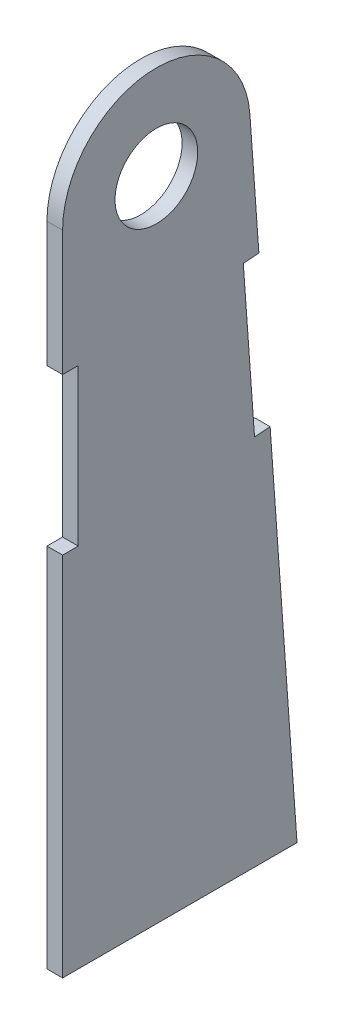
ISO-10303-21;
HEADER;
FILE_DESCRIPTION(('STEP AP214'),'2;1');
FILE_NAME('part.step','',(''),(''),'','','');
FILE_SCHEMA(('AUTOMOTIVE_DESIGN { 1 0 10303 214 1 1 1 1 }'));
ENDSEC;
DATA;
#1=APPLICATION_CONTEXT('core data for automotive mechanical design processes');
#2=APPLICATION_PROTOCOL_DEFINITION('international standard','automotive_design',2000,#1);
#3=PRODUCT_CONTEXT('',#1,'mechanical');
#4=PRODUCT('Part','Part','',(#3));
#5=PRODUCT_RELATED_PRODUCT_CATEGORY('part','',(#4));
#6=PRODUCT_DEFINITION_FORMATION('','',#4);
#7=PRODUCT_DEFINITION_CONTEXT('part definition',#1,'design');
#8=PRODUCT_DEFINITION('design','',#6,#7);
#9=PRODUCT_DEFINITION_SHAPE('','',#8);
#10=(LENGTH_UNIT() NAMED_UNIT(*) SI_UNIT(.MILLI.,.METRE.));
#11=(NAMED_UNIT(*) PLANE_ANGLE_UNIT() SI_UNIT($,.RADIAN.));
#12=(NAMED_UNIT(*) SI_UNIT($,.STERADIAN.) SOLID_ANGLE_UNIT());
#13=UNCERTAINTY_MEASURE_WITH_UNIT(LENGTH_MEASURE(1.E-05),#10,'distance_accuracy_value','');
#14=(GEOMETRIC_REPRESENTATION_CONTEXT(3) GLOBAL_UNCERTAINTY_ASSIGNED_CONTEXT((#13)) GLOBAL_UNIT_ASSIGNED_CONTEXT((#10,
#11,#12)) REPRESENTATION_CONTEXT('',''));
#15=CARTESIAN_POINT('',(0.,0.,0.));
#16=DIRECTION('',(0.,0.,1.));
#17=DIRECTION('',(1.,0.,0.));
#18=AXIS2_PLACEMENT_3D('',#15,#16,#17);
#19=CARTESIAN_POINT('',(1.5875,0.684323550732295,-9.50038558574931));
#20=DIRECTION('',(0.,-0.0718449922028656,0.997415809527486));
#21=DIRECTION('',(0.,-0.997415809527486,-0.0718449922028656));
#22=AXIS2_PLACEMENT_3D('',#19,#20,#21);
#23=PLANE('',#22);
#24=DIRECTION('',(0.,0.997415809527486,0.0718449922028656));
#25=VECTOR('',#24,1.);
#26=CARTESIAN_POINT('',(0.,0.684323550732295,-9.50038558574931));
#27=LINE('',#26,#25);
#28=CARTESIAN_POINT('',(0.,-11.9828572302668,-10.4128169867257));
#29=VERTEX_POINT('',#28);
#30=CARTESIAN_POINT('',(0.,0.684323550732295,-9.50038558574931));
#31=VERTEX_POINT('',#30);
#32=EDGE_CURVE('E177',#29,#31,#27,.T.);
#33=ORIENTED_EDGE('',*,*,#32,.T.);
#34=DIRECTION('',(-1.,0.,0.));
#35=VECTOR('',#34,1.);
#36=CARTESIAN_POINT('',(1.5875,0.684323550732295,-9.50038558574931));
#37=LINE('',#36,#35);
#38=CARTESIAN_POINT('',(1.5875,0.684323550732295,-9.50038558574931));
#39=VERTEX_POINT('',#38);
#40=EDGE_CURVE('E11',#39,#31,#37,.T.);
#41=ORIENTED_EDGE('',*,*,#40,.F.);
#42=DIRECTION('',(0.,0.997415809527486,0.0718449922028656));
#43=VECTOR('',#42,1.);
#44=CARTESIAN_POINT('',(1.5875,0.684323550732295,-9.50038558574931));
#45=LINE('',#44,#43);
#46=CARTESIAN_POINT('',(1.5875,-11.9828572302668,-10.4128169867257));
#47=VERTEX_POINT('',#46);
#48=EDGE_CURVE('E216',#47,#39,#45,.T.);
#49=ORIENTED_EDGE('',*,*,#48,.F.);
#50=DIRECTION('',(-1.,0.,0.));
#51=VECTOR('',#50,1.);
#52=CARTESIAN_POINT('',(1.5875,-11.9828572302668,-10.4128169867257));
#53=LINE('',#52,#51);
#54=EDGE_CURVE('E65',#47,#29,#53,.T.);
#55=ORIENTED_EDGE('',*,*,#54,.T.);
#56=EDGE_LOOP('',(#33,#41,#49,#55));
#57=FACE_BOUND('',#56,.T.);
#58=ADVANCED_FACE('F47',(#57),#23,.F.);
#59=CARTESIAN_POINT('',(1.5875,0.,0.));
#60=DIRECTION('',(-1.,0.,0.));
#61=DIRECTION('',(0.,0.,1.));
#62=AXIS2_PLACEMENT_3D('',#59,#60,#61);
#63=CYLINDRICAL_SURFACE('',#62,9.525);
#64=CARTESIAN_POINT('',(0.,0.,0.));
#65=DIRECTION('',(1.,0.,0.));
#66=DIRECTION('',(0.,0.,-1.));
#67=AXIS2_PLACEMENT_3D('',#64,#65,#66);
#68=CIRCLE('',#67,9.525);
#69=CARTESIAN_POINT('',(0.,0.,9.525));
#70=VERTEX_POINT('',#69);
#71=EDGE_CURVE('E180',#31,#70,#68,.T.);
#72=ORIENTED_EDGE('',*,*,#71,.T.);
#73=DIRECTION('',(-1.,0.,0.));
#74=VECTOR('',#73,1.);
#75=CARTESIAN_POINT('',(1.5875,0.,9.525));
#76=LINE('',#75,#74);
#77=CARTESIAN_POINT('',(1.5875,0.,9.525));
#78=VERTEX_POINT('',#77);
#79=EDGE_CURVE('E57',#78,#70,#76,.T.);
#80=ORIENTED_EDGE('',*,*,#79,.F.);
#81=CARTESIAN_POINT('',(1.5875,0.,0.));
#82=DIRECTION('',(1.,0.,0.));
#83=DIRECTION('',(0.,0.,-1.));
#84=AXIS2_PLACEMENT_3D('',#81,#82,#83);
#85=CIRCLE('',#84,9.525);
#86=EDGE_CURVE('E116',#39,#78,#85,.T.);
#87=ORIENTED_EDGE('',*,*,#86,.F.);
#88=ORIENTED_EDGE('',*,*,#40,.T.);
#89=EDGE_LOOP('',(#72,#80,#87,#88));
#90=FACE_BOUND('',#89,.T.);
#91=ADVANCED_FACE('F49',(#90),#63,.T.);
#92=CARTESIAN_POINT('',(1.5875,0.,9.525));
#93=DIRECTION('',(0.,0.,1.));
#94=DIRECTION('',(0.,-1.,0.));
#95=AXIS2_PLACEMENT_3D('',#92,#93,#94);
#96=PLANE('',#95);
#97=DIRECTION('',(0.,1.,0.));
#98=VECTOR('',#97,1.);
#99=CARTESIAN_POINT('',(0.,0.,9.525));
#100=LINE('',#99,#98);
#101=CARTESIAN_POINT('',(0.,-12.7,9.52500000000002));
#102=VERTEX_POINT('',#101);
#103=EDGE_CURVE('E186',#102,#70,#100,.T.);
#104=ORIENTED_EDGE('',*,*,#103,.F.);
#105=DIRECTION('',(-1.,0.,0.));
#106=VECTOR('',#105,1.);
#107=CARTESIAN_POINT('',(1.5875,-12.7,9.52500000000002));
#108=LINE('',#107,#106);
#109=CARTESIAN_POINT('',(1.5875,-12.7,9.52500000000002));
#110=VERTEX_POINT('',#109);
#111=EDGE_CURVE('E238',#110,#102,#108,.T.);
#112=ORIENTED_EDGE('',*,*,#111,.F.);
#113=DIRECTION('',(0.,1.,0.));
#114=VECTOR('',#113,1.);
#115=CARTESIAN_POINT('',(1.5875,0.,9.525));
#116=LINE('',#115,#114);
#117=EDGE_CURVE('E248',#110,#78,#116,.T.);
#118=ORIENTED_EDGE('',*,*,#117,.T.);
#119=ORIENTED_EDGE('',*,*,#79,.T.);
#120=EDGE_LOOP('',(#104,#112,#118,#119));
#121=FACE_BOUND('',#120,.T.);
#122=ADVANCED_FACE('F246',(#121),#96,.T.);
#123=CARTESIAN_POINT('',(1.5875,-12.7,0.));
#124=DIRECTION('',(0.,1.,0.));
#125=DIRECTION('',(0.,0.,1.));
#126=AXIS2_PLACEMENT_3D('',#123,#124,#125);
#127=PLANE('',#126);
#128=DIRECTION('',(0.,0.,-1.));
#129=VECTOR('',#128,1.);
#130=CARTESIAN_POINT('',(0.,-12.7,0.));
#131=LINE('',#130,#129);
#132=CARTESIAN_POINT('',(0.,-12.7,7.93750000000001));
#133=VERTEX_POINT('',#132);
#134=EDGE_CURVE('E190',#102,#133,#131,.T.);
#135=ORIENTED_EDGE('',*,*,#134,.T.);
#136=DIRECTION('',(-1.,0.,0.));
#137=VECTOR('',#136,1.);
#138=CARTESIAN_POINT('',(1.5875,-12.7,7.93750000000001));
#139=LINE('',#138,#137);
#140=CARTESIAN_POINT('',(1.5875,-12.7,7.93750000000001));
#141=VERTEX_POINT('',#140);
#142=EDGE_CURVE('E235',#141,#133,#139,.T.);
#143=ORIENTED_EDGE('',*,*,#142,.F.);
#144=DIRECTION('',(0.,0.,-1.));
#145=VECTOR('',#144,1.);
#146=CARTESIAN_POINT('',(1.5875,-12.7,0.));
#147=LINE('',#146,#145);
#148=EDGE_CURVE('E259',#110,#141,#147,.T.);
#149=ORIENTED_EDGE('',*,*,#148,.F.);
#150=ORIENTED_EDGE('',*,*,#111,.T.);
#151=EDGE_LOOP('',(#135,#143,#149,#150));
#152=FACE_BOUND('',#151,.T.);
#153=ADVANCED_FACE('F256',(#152),#127,.F.);
#154=CARTESIAN_POINT('',(1.5875,0.,7.93749999999998));
#155=DIRECTION('',(0.,0.,1.));
#156=DIRECTION('',(0.,-1.,0.));
#157=AXIS2_PLACEMENT_3D('',#154,#155,#156);
#158=PLANE('',#157);
#159=DIRECTION('',(0.,1.,0.));
#160=VECTOR('',#159,1.);
#161=CARTESIAN_POINT('',(0.,0.,7.93749999999998));
#162=LINE('',#161,#160);
#163=CARTESIAN_POINT('',(0.,-28.575,7.93750000000005));
#164=VERTEX_POINT('',#163);
#165=EDGE_CURVE('E195',#164,#133,#162,.T.);
#166=ORIENTED_EDGE('',*,*,#165,.F.);
#167=DIRECTION('',(-1.,0.,0.));
#168=VECTOR('',#167,1.);
#169=CARTESIAN_POINT('',(1.5875,-28.575,7.93750000000005));
#170=LINE('',#169,#168);
#171=CARTESIAN_POINT('',(1.5875,-28.575,7.93750000000005));
#172=VERTEX_POINT('',#171);
#173=EDGE_CURVE('E232',#172,#164,#170,.T.);
#174=ORIENTED_EDGE('',*,*,#173,.F.);
#175=DIRECTION('',(0.,1.,0.));
#176=VECTOR('',#175,1.);
#177=CARTESIAN_POINT('',(1.5875,0.,7.93749999999998));
#178=LINE('',#177,#176);
#179=EDGE_CURVE('E262',#172,#141,#178,.T.);
#180=ORIENTED_EDGE('',*,*,#179,.T.);
#181=ORIENTED_EDGE('',*,*,#142,.T.);
#182=EDGE_LOOP('',(#166,#174,#180,#181));
#183=FACE_BOUND('',#182,.T.);
#184=ADVANCED_FACE('F293',(#183),#158,.T.);
#185=CARTESIAN_POINT('',(1.5875,-28.575,0.));
#186=DIRECTION('',(0.,1.,0.));
#187=DIRECTION('',(0.,0.,1.));
#188=AXIS2_PLACEMENT_3D('',#185,#186,#187);
#189=PLANE('',#188);
#190=DIRECTION('',(0.,0.,-1.));
#191=VECTOR('',#190,1.);
#192=CARTESIAN_POINT('',(0.,-28.575,0.));
#193=LINE('',#192,#191);
#194=CARTESIAN_POINT('',(0.,-28.575,9.52500000000005));
#195=VERTEX_POINT('',#194);
#196=EDGE_CURVE('E199',#195,#164,#193,.T.);
#197=ORIENTED_EDGE('',*,*,#196,.F.);
#198=DIRECTION('',(-1.,0.,0.));
#199=VECTOR('',#198,1.);
#200=CARTESIAN_POINT('',(1.5875,-28.575,9.52500000000005));
#201=LINE('',#200,#199);
#202=CARTESIAN_POINT('',(1.5875,-28.575,9.52500000000005));
#203=VERTEX_POINT('',#202);
#204=EDGE_CURVE('E229',#203,#195,#201,.T.);
#205=ORIENTED_EDGE('',*,*,#204,.F.);
#206=DIRECTION('',(0.,0.,-1.));
#207=VECTOR('',#206,1.);
#208=CARTESIAN_POINT('',(1.5875,-28.575,0.));
#209=LINE('',#208,#207);
#210=EDGE_CURVE('E274',#203,#172,#209,.T.);
#211=ORIENTED_EDGE('',*,*,#210,.T.);
#212=ORIENTED_EDGE('',*,*,#173,.T.);
#213=EDGE_LOOP('',(#197,#205,#211,#212));
#214=FACE_BOUND('',#213,.T.);
#215=ADVANCED_FACE('F336',(#214),#189,.T.);
#216=CARTESIAN_POINT('',(0.,-65.7746383391697,9.52500000000011));
#217=VERTEX_POINT('',#216);
#218=EDGE_CURVE('E191',#217,#195,#100,.T.);
#219=ORIENTED_EDGE('',*,*,#218,.F.);
#220=DIRECTION('',(-1.,0.,0.));
#221=VECTOR('',#220,1.);
#222=CARTESIAN_POINT('',(1.5875,-65.7746383391697,9.52500000000011));
#223=LINE('',#222,#221);
#224=CARTESIAN_POINT('',(1.5875,-65.7746383391697,9.52500000000011));
#225=VERTEX_POINT('',#224);
#226=EDGE_CURVE('E226',#225,#217,#223,.T.);
#227=ORIENTED_EDGE('',*,*,#226,.F.);
#228=EDGE_CURVE('E266',#225,#203,#116,.T.);
#229=ORIENTED_EDGE('',*,*,#228,.T.);
#230=ORIENTED_EDGE('',*,*,#204,.T.);
#231=EDGE_LOOP('',(#219,#227,#229,#230));
#232=FACE_BOUND('',#231,.T.);
#233=ADVANCED_FACE('F332',(#232),#96,.T.);
#234=CARTESIAN_POINT('',(1.5875,-65.7746383391697,0.));
#235=DIRECTION('',(0.,-1.,0.));
#236=DIRECTION('',(0.,0.,-1.));
#237=AXIS2_PLACEMENT_3D('',#234,#235,#236);
#238=PLANE('',#237);
#239=DIRECTION('',(0.,0.,1.));
#240=VECTOR('',#239,1.);
#241=CARTESIAN_POINT('',(0.,-65.7746383391697,0.));
#242=LINE('',#241,#240);
#243=CARTESIAN_POINT('',(0.,-65.7746383391697,-14.2875));
#244=VERTEX_POINT('',#243);
#245=EDGE_CURVE('E203',#244,#217,#242,.T.);
#246=ORIENTED_EDGE('',*,*,#245,.F.);
#247=DIRECTION('',(-1.,0.,0.));
#248=VECTOR('',#247,1.);
#249=CARTESIAN_POINT('',(1.5875,-65.7746383391697,-14.2875));
#250=LINE('',#249,#248);
#251=CARTESIAN_POINT('',(1.5875,-65.7746383391697,-14.2875));
#252=VERTEX_POINT('',#251);
#253=EDGE_CURVE('E223',#252,#244,#250,.T.);
#254=ORIENTED_EDGE('',*,*,#253,.F.);
#255=DIRECTION('',(0.,0.,1.));
#256=VECTOR('',#255,1.);
#257=CARTESIAN_POINT('',(1.5875,-65.7746383391697,0.));
#258=LINE('',#257,#256);
#259=EDGE_CURVE('E273',#252,#225,#258,.T.);
#260=ORIENTED_EDGE('',*,*,#259,.T.);
#261=ORIENTED_EDGE('',*,*,#226,.T.);
#262=EDGE_LOOP('',(#246,#254,#260,#261));
#263=FACE_BOUND('',#262,.T.);
#264=ADVANCED_FACE('F296',(#263),#238,.T.);
#265=CARTESIAN_POINT('',(0.,-27.8168332065156,-11.5533562379462));
#266=VERTEX_POINT('',#265);
#267=EDGE_CURVE('E182',#244,#266,#27,.T.);
#268=ORIENTED_EDGE('',*,*,#267,.T.);
#269=DIRECTION('',(-1.,0.,0.));
#270=VECTOR('',#269,1.);
#271=CARTESIAN_POINT('',(1.5875,-27.8168332065156,-11.5533562379462));
#272=LINE('',#271,#270);
#273=CARTESIAN_POINT('',(1.5875,-27.8168332065156,-11.5533562379462));
#274=VERTEX_POINT('',#273);
#275=EDGE_CURVE('E165',#274,#266,#272,.T.);
#276=ORIENTED_EDGE('',*,*,#275,.F.);
#277=EDGE_CURVE('E151',#252,#274,#45,.T.);
#278=ORIENTED_EDGE('',*,*,#277,.F.);
#279=ORIENTED_EDGE('',*,*,#253,.T.);
#280=EDGE_LOOP('',(#268,#276,#278,#279));
#281=FACE_BOUND('',#280,.T.);
#282=ADVANCED_FACE('F300',(#281),#23,.F.);
#283=CARTESIAN_POINT('',(1.5875,-28.5011567572479,-2.05297065219686));
#284=DIRECTION('',(0.,-0.997415809527486,-0.0718449922028647));
#285=DIRECTION('',(0.,0.0718449922028648,-0.997415809527486));
#286=AXIS2_PLACEMENT_3D('',#283,#284,#285);
#287=PLANE('',#286);
#288=DIRECTION('',(0.,-0.0718449922028648,0.997415809527486));
#289=VECTOR('',#288,1.);
#290=CARTESIAN_POINT('',(0.,-28.5011567572479,-2.05297065219686));
#291=LINE('',#290,#289);
#292=CARTESIAN_POINT('',(0.,-27.9308871316377,-9.96995864032131));
#293=VERTEX_POINT('',#292);
#294=EDGE_CURVE('E161',#266,#293,#291,.T.);
#295=ORIENTED_EDGE('',*,*,#294,.T.);
#296=DIRECTION('',(-1.,0.,0.));
#297=VECTOR('',#296,1.);
#298=CARTESIAN_POINT('',(1.5875,-27.9308871316377,-9.96995864032131));
#299=LINE('',#298,#297);
#300=CARTESIAN_POINT('',(1.5875,-27.9308871316377,-9.96995864032131));
#301=VERTEX_POINT('',#300);
#302=EDGE_CURVE('E158',#301,#293,#299,.T.);
#303=ORIENTED_EDGE('',*,*,#302,.F.);
#304=DIRECTION('',(0.,-0.0718449922028648,0.997415809527486));
#305=VECTOR('',#304,1.);
#306=CARTESIAN_POINT('',(1.5875,-28.5011567572479,-2.05297065219686));
#307=LINE('',#306,#305);
#308=EDGE_CURVE('E143',#274,#301,#307,.T.);
#309=ORIENTED_EDGE('',*,*,#308,.F.);
#310=ORIENTED_EDGE('',*,*,#275,.T.);
#311=EDGE_LOOP('',(#295,#303,#309,#310));
#312=FACE_BOUND('',#311,.T.);
#313=ADVANCED_FACE('F159',(#312),#287,.F.);
#314=CARTESIAN_POINT('',(1.5875,0.570269625610247,-7.91698798812442));
#315=DIRECTION('',(0.,-0.0718449922028657,0.997415809527486));
#316=DIRECTION('',(0.,-0.997415809527486,-0.0718449922028657));
#317=AXIS2_PLACEMENT_3D('',#314,#315,#316);
#318=PLANE('',#317);
#319=DIRECTION('',(0.,0.997415809527486,0.0718449922028657));
#320=VECTOR('',#319,1.);
#321=CARTESIAN_POINT('',(0.,0.570269625610247,-7.91698798812442));
#322=LINE('',#321,#320);
#323=CARTESIAN_POINT('',(0.,-12.0969111553888,-8.82941938910081));
#324=VERTEX_POINT('',#323);
#325=EDGE_CURVE('E209',#293,#324,#322,.T.);
#326=ORIENTED_EDGE('',*,*,#325,.T.);
#327=DIRECTION('',(-1.,0.,0.));
#328=VECTOR('',#327,1.);
#329=CARTESIAN_POINT('',(1.5875,-12.0969111553888,-8.82941938910081));
#330=LINE('',#329,#328);
#331=CARTESIAN_POINT('',(1.5875,-12.0969111553888,-8.82941938910081));
#332=VERTEX_POINT('',#331);
#333=EDGE_CURVE('E104',#332,#324,#330,.T.);
#334=ORIENTED_EDGE('',*,*,#333,.F.);
#335=DIRECTION('',(0.,0.997415809527486,0.0718449922028657));
#336=VECTOR('',#335,1.);
#337=CARTESIAN_POINT('',(1.5875,0.570269625610247,-7.91698798812442));
#338=LINE('',#337,#336);
#339=EDGE_CURVE('E148',#301,#332,#338,.T.);
#340=ORIENTED_EDGE('',*,*,#339,.F.);
#341=ORIENTED_EDGE('',*,*,#302,.T.);
#342=EDGE_LOOP('',(#326,#334,#340,#341));
#343=FACE_BOUND('',#342,.T.);
#344=ADVANCED_FACE('F167',(#343),#318,.F.);
#345=CARTESIAN_POINT('',(1.5875,-12.6671807809991,-0.91243140097641));
#346=DIRECTION('',(0.,-0.997415809527486,-0.0718449922028669));
#347=DIRECTION('',(0.,0.0718449922028669,-0.997415809527486));
#348=AXIS2_PLACEMENT_3D('',#345,#346,#347);
#349=PLANE('',#348);
#350=DIRECTION('',(0.,-0.0718449922028669,0.997415809527486));
#351=VECTOR('',#350,1.);
#352=CARTESIAN_POINT('',(0.,-12.6671807809991,-0.91243140097641));
#353=LINE('',#352,#351);
#354=EDGE_CURVE('E212',#29,#324,#353,.T.);
#355=ORIENTED_EDGE('',*,*,#354,.F.);
#356=ORIENTED_EDGE('',*,*,#54,.F.);
#357=DIRECTION('',(0.,-0.0718449922028669,0.997415809527486));
#358=VECTOR('',#357,1.);
#359=CARTESIAN_POINT('',(1.5875,-12.6671807809991,-0.91243140097641));
#360=LINE('',#359,#358);
#361=EDGE_CURVE('E169',#47,#332,#360,.T.);
#362=ORIENTED_EDGE('',*,*,#361,.T.);
#363=ORIENTED_EDGE('',*,*,#333,.T.);
#364=EDGE_LOOP('',(#355,#356,#362,#363));
#365=FACE_BOUND('',#364,.T.);
#366=ADVANCED_FACE('F309',(#365),#349,.T.);
#367=CARTESIAN_POINT('',(1.5875,0.,0.));
#368=DIRECTION('',(1.,0.,0.));
#369=DIRECTION('',(0.,0.,-1.));
#370=AXIS2_PLACEMENT_3D('',#367,#368,#369);
#371=PLANE('',#370);
#372=CARTESIAN_POINT('',(1.5875,0.,0.));
#373=DIRECTION('',(1.,0.,0.));
#374=DIRECTION('',(0.,0.,-1.));
#375=AXIS2_PLACEMENT_3D('',#372,#373,#374);
#376=CIRCLE('',#375,4.2);
#377=CARTESIAN_POINT('',(1.5875,0.,-4.2));
#378=VERTEX_POINT('',#377);
#379=EDGE_CURVE('E470',#378,#378,#376,.T.);
#380=ORIENTED_EDGE('',*,*,#379,.F.);
#381=EDGE_LOOP('',(#380));
#382=FACE_BOUND('',#381,.T.);
#383=ORIENTED_EDGE('',*,*,#48,.T.);
#384=ORIENTED_EDGE('',*,*,#86,.T.);
#385=ORIENTED_EDGE('',*,*,#117,.F.);
#386=ORIENTED_EDGE('',*,*,#148,.T.);
#387=ORIENTED_EDGE('',*,*,#179,.F.);
#388=ORIENTED_EDGE('',*,*,#210,.F.);
#389=ORIENTED_EDGE('',*,*,#228,.F.);
#390=ORIENTED_EDGE('',*,*,#259,.F.);
#391=ORIENTED_EDGE('',*,*,#277,.T.);
#392=ORIENTED_EDGE('',*,*,#308,.T.);
#393=ORIENTED_EDGE('',*,*,#339,.T.);
#394=ORIENTED_EDGE('',*,*,#361,.F.);
#395=EDGE_LOOP('',(#383,#384,#385,#386,#387,#388,#389,#390,#391,#392,#393,#394));
#396=FACE_BOUND('',#395,.T.);
#397=ADVANCED_FACE('F145',(#382,#396),#371,.T.);
#398=CARTESIAN_POINT('',(0.,0.,0.));
#399=DIRECTION('',(1.,0.,0.));
#400=DIRECTION('',(0.,0.,-1.));
#401=AXIS2_PLACEMENT_3D('',#398,#399,#400);
#402=PLANE('',#401);
#403=CARTESIAN_POINT('',(0.,0.,0.));
#404=DIRECTION('',(1.,0.,0.));
#405=DIRECTION('',(0.,0.,-1.));
#406=AXIS2_PLACEMENT_3D('',#403,#404,#405);
#407=CIRCLE('',#406,4.2);
#408=CARTESIAN_POINT('',(0.,0.,-4.2));
#409=VERTEX_POINT('',#408);
#410=EDGE_CURVE('E181',#409,#409,#407,.T.);
#411=ORIENTED_EDGE('',*,*,#410,.T.);
#412=EDGE_LOOP('',(#411));
#413=FACE_BOUND('',#412,.T.);
#414=ORIENTED_EDGE('',*,*,#32,.F.);
#415=ORIENTED_EDGE('',*,*,#354,.T.);
#416=ORIENTED_EDGE('',*,*,#325,.F.);
#417=ORIENTED_EDGE('',*,*,#294,.F.);
#418=ORIENTED_EDGE('',*,*,#267,.F.);
#419=ORIENTED_EDGE('',*,*,#245,.T.);
#420=ORIENTED_EDGE('',*,*,#218,.T.);
#421=ORIENTED_EDGE('',*,*,#196,.T.);
#422=ORIENTED_EDGE('',*,*,#165,.T.);
#423=ORIENTED_EDGE('',*,*,#134,.F.);
#424=ORIENTED_EDGE('',*,*,#103,.T.);
#425=ORIENTED_EDGE('',*,*,#71,.F.);
#426=EDGE_LOOP('',(#414,#415,#416,#417,#418,#419,#420,#421,#422,#423,#424,#425));
#427=FACE_BOUND('',#426,.T.);
#428=ADVANCED_FACE('F252',(#413,#427),#402,.F.);
#429=CARTESIAN_POINT('',(1.5875,0.,0.));
#430=DIRECTION('',(1.,0.,0.));
#431=DIRECTION('',(0.,0.,-1.));
#432=AXIS2_PLACEMENT_3D('',#429,#430,#431);
#433=CYLINDRICAL_SURFACE('',#432,4.2);
#434=ORIENTED_EDGE('',*,*,#410,.F.);
#435=EDGE_LOOP('',(#434));
#436=FACE_BOUND('',#435,.T.);
#437=ORIENTED_EDGE('',*,*,#379,.T.);
#438=EDGE_LOOP('',(#437));
#439=FACE_BOUND('',#438,.T.);
#440=ADVANCED_FACE('F433',(#436,#439),#433,.F.);
#441=CLOSED_SHELL('',(#58,#91,#122,#153,#184,#215,#233,#264,#282,#313,#344,#366,#397,#428,#440));
#442=MANIFOLD_SOLID_BREP('B2',#441);
#443=ADVANCED_BREP_SHAPE_REPRESENTATION('',(#18,#442),#14);
#444=SHAPE_DEFINITION_REPRESENTATION(#9,#443);
ENDSEC;
END-ISO-10303-21;
